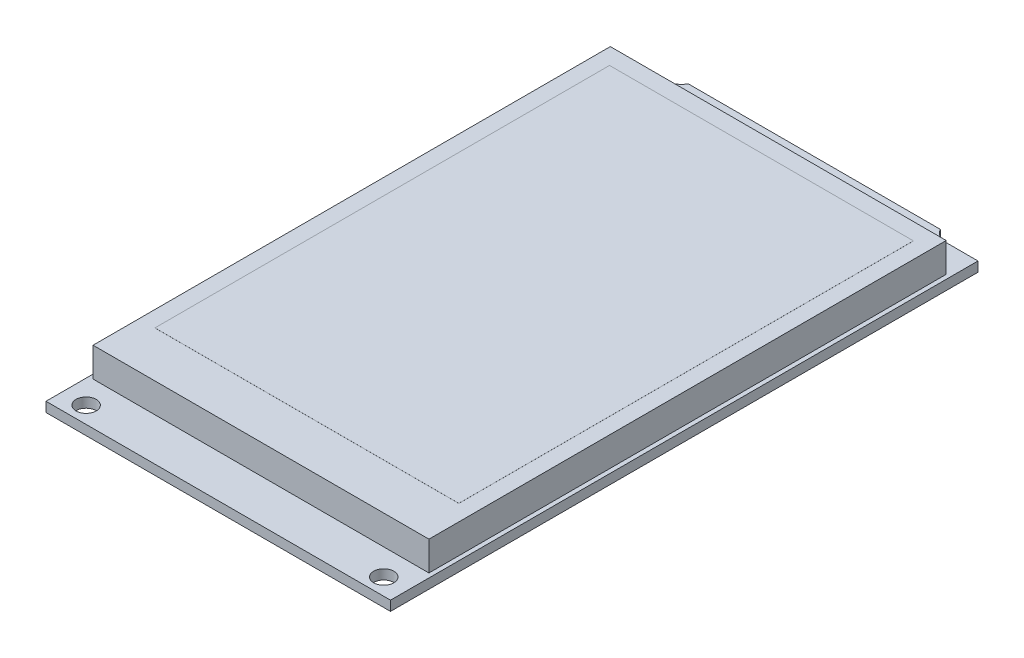
ISO-10303-21;
HEADER;
FILE_DESCRIPTION(('STEP AP214'),'2;1');
FILE_NAME('part.step','',(''),(''),'','','');
FILE_SCHEMA(('AUTOMOTIVE_DESIGN { 1 0 10303 214 1 1 1 1 }'));
ENDSEC;
DATA;
#1=APPLICATION_CONTEXT('core data for automotive mechanical design processes');
#2=APPLICATION_PROTOCOL_DEFINITION('international standard','automotive_design',2000,#1);
#3=PRODUCT_CONTEXT('',#1,'mechanical');
#4=PRODUCT('Part','Part','',(#3));
#5=PRODUCT_RELATED_PRODUCT_CATEGORY('part','',(#4));
#6=PRODUCT_DEFINITION_FORMATION('','',#4);
#7=PRODUCT_DEFINITION_CONTEXT('part definition',#1,'design');
#8=PRODUCT_DEFINITION('design','',#6,#7);
#9=PRODUCT_DEFINITION_SHAPE('','',#8);
#10=(LENGTH_UNIT() NAMED_UNIT(*) SI_UNIT(.MILLI.,.METRE.));
#11=(NAMED_UNIT(*) PLANE_ANGLE_UNIT() SI_UNIT($,.RADIAN.));
#12=(NAMED_UNIT(*) SI_UNIT($,.STERADIAN.) SOLID_ANGLE_UNIT());
#13=UNCERTAINTY_MEASURE_WITH_UNIT(LENGTH_MEASURE(1.E-05),#10,'distance_accuracy_value','');
#14=(GEOMETRIC_REPRESENTATION_CONTEXT(3) GLOBAL_UNCERTAINTY_ASSIGNED_CONTEXT((#13)) GLOBAL_UNIT_ASSIGNED_CONTEXT((#10,
#11,#12)) REPRESENTATION_CONTEXT('',''));
#15=CARTESIAN_POINT('',(0.,0.,0.));
#16=DIRECTION('',(0.,0.,1.));
#17=DIRECTION('',(1.,0.,0.));
#18=AXIS2_PLACEMENT_3D('',#15,#16,#17);
#19=CARTESIAN_POINT('',(78.3529749767891,1.6,-98.8305691327379));
#20=DIRECTION('',(0.,1.,0.));
#21=DIRECTION('',(0.,0.,1.));
#22=AXIS2_PLACEMENT_3D('',#19,#20,#21);
#23=PLANE('',#22);
#24=DIRECTION('',(0.,0.,-1.));
#25=VECTOR('',#24,1.);
#26=CARTESIAN_POINT('',(82.8863359694958,1.6,-7.));
#27=LINE('',#26,#25);
#28=CARTESIAN_POINT('',(82.8863359694958,1.6,-7.));
#29=VERTEX_POINT('',#28);
#30=CARTESIAN_POINT('',(82.8863359694958,1.6,-91.7));
#31=VERTEX_POINT('',#30);
#32=EDGE_CURVE('E160',#29,#31,#27,.T.);
#33=ORIENTED_EDGE('',*,*,#32,.F.);
#34=DIRECTION('',(1.,0.,0.));
#35=VECTOR('',#34,1.);
#36=CARTESIAN_POINT('',(55.3863359694958,1.6,-7.));
#37=LINE('',#36,#35);
#38=CARTESIAN_POINT('',(27.8863359694958,1.6,-7.));
#39=VERTEX_POINT('',#38);
#40=EDGE_CURVE('E187',#39,#29,#37,.T.);
#41=ORIENTED_EDGE('',*,*,#40,.F.);
#42=DIRECTION('',(0.,0.,1.));
#43=VECTOR('',#42,1.);
#44=CARTESIAN_POINT('',(27.8863359694958,1.6,-7.));
#45=LINE('',#44,#43);
#46=CARTESIAN_POINT('',(27.8863359694958,1.6,-91.7));
#47=VERTEX_POINT('',#46);
#48=EDGE_CURVE('E200',#47,#39,#45,.T.);
#49=ORIENTED_EDGE('',*,*,#48,.F.);
#50=DIRECTION('',(-1.,0.,0.));
#51=VECTOR('',#50,1.);
#52=CARTESIAN_POINT('',(27.8863359694958,1.6,-91.7));
#53=LINE('',#52,#51);
#54=EDGE_CURVE('E197',#31,#47,#53,.T.);
#55=ORIENTED_EDGE('',*,*,#54,.F.);
#56=EDGE_LOOP('',(#33,#41,#49,#55));
#57=FACE_BOUND('',#56,.T.);
#58=CARTESIAN_POINT('',(31.0213359694958,1.6,-2.73000000000002));
#59=DIRECTION('',(0.,1.,0.));
#60=DIRECTION('',(0.,0.,1.));
#61=AXIS2_PLACEMENT_3D('',#58,#59,#60);
#62=CIRCLE('',#61,1.65);
#63=CARTESIAN_POINT('',(31.0213359694958,1.6,-1.08000000000002));
#64=VERTEX_POINT('',#63);
#65=EDGE_CURVE('E223',#64,#64,#62,.T.);
#66=ORIENTED_EDGE('',*,*,#65,.F.);
#67=EDGE_LOOP('',(#66));
#68=FACE_BOUND('',#67,.T.);
#69=DIRECTION('',(0.,0.,1.));
#70=VECTOR('',#69,1.);
#71=CARTESIAN_POINT('',(27.1813359694958,1.6,-96.2));
#72=LINE('',#71,#70);
#73=CARTESIAN_POINT('',(27.1813359694958,1.6,-96.2));
#74=VERTEX_POINT('',#73);
#75=CARTESIAN_POINT('',(27.1813359694958,1.6,0.));
#76=VERTEX_POINT('',#75);
#77=EDGE_CURVE('E229',#74,#76,#72,.T.);
#78=ORIENTED_EDGE('',*,*,#77,.T.);
#79=DIRECTION('',(1.,0.,0.));
#80=VECTOR('',#79,1.);
#81=CARTESIAN_POINT('',(27.1813359694958,1.6,0.));
#82=LINE('',#81,#80);
#83=CARTESIAN_POINT('',(83.5913359694958,1.6,0.));
#84=VERTEX_POINT('',#83);
#85=EDGE_CURVE('E232',#76,#84,#82,.T.);
#86=ORIENTED_EDGE('',*,*,#85,.T.);
#87=DIRECTION('',(0.,0.,-1.));
#88=VECTOR('',#87,1.);
#89=CARTESIAN_POINT('',(83.5913359694958,1.6,0.));
#90=LINE('',#89,#88);
#91=CARTESIAN_POINT('',(83.5913359694958,1.6,-96.2));
#92=VERTEX_POINT('',#91);
#93=EDGE_CURVE('E235',#84,#92,#90,.T.);
#94=ORIENTED_EDGE('',*,*,#93,.T.);
#95=DIRECTION('',(-1.,0.,0.));
#96=VECTOR('',#95,1.);
#97=CARTESIAN_POINT('',(83.5913359694958,1.6,-96.2));
#98=LINE('',#97,#96);
#99=CARTESIAN_POINT('',(78.2654792706503,1.6,-96.2));
#100=VERTEX_POINT('',#99);
#101=EDGE_CURVE('E237',#92,#100,#98,.T.);
#102=ORIENTED_EDGE('',*,*,#101,.T.);
#103=CARTESIAN_POINT('',(78.3529749767891,1.6,-98.8305691327379));
#104=DIRECTION('',(0.,-1.,0.));
#105=DIRECTION('',(0.,0.,1.));
#106=AXIS2_PLACEMENT_3D('',#103,#104,#105);
#107=CIRCLE('',#106,2.63202383361284);
#108=CARTESIAN_POINT('',(76.0263359694958,1.6,-97.6));
#109=VERTEX_POINT('',#108);
#110=EDGE_CURVE('E239',#100,#109,#107,.T.);
#111=ORIENTED_EDGE('',*,*,#110,.T.);
#112=DIRECTION('',(-1.,0.,0.));
#113=VECTOR('',#112,1.);
#114=CARTESIAN_POINT('',(55.3863359694958,1.6,-97.6));
#115=LINE('',#114,#113);
#116=CARTESIAN_POINT('',(34.7463359694958,1.6,-97.6));
#117=VERTEX_POINT('',#116);
#118=EDGE_CURVE('E241',#109,#117,#115,.T.);
#119=ORIENTED_EDGE('',*,*,#118,.T.);
#120=CARTESIAN_POINT('',(32.4196969622025,1.6,-98.8305691327379));
#121=DIRECTION('',(0.,-1.,0.));
#122=DIRECTION('',(0.,0.,-1.));
#123=AXIS2_PLACEMENT_3D('',#120,#121,#122);
#124=CIRCLE('',#123,2.63202383361284);
#125=CARTESIAN_POINT('',(32.5071926683412,1.6,-96.2));
#126=VERTEX_POINT('',#125);
#127=EDGE_CURVE('E243',#117,#126,#124,.T.);
#128=ORIENTED_EDGE('',*,*,#127,.T.);
#129=DIRECTION('',(-1.,0.,0.));
#130=VECTOR('',#129,1.);
#131=CARTESIAN_POINT('',(32.5071926683412,1.6,-96.2));
#132=LINE('',#131,#130);
#133=EDGE_CURVE('E245',#126,#74,#132,.T.);
#134=ORIENTED_EDGE('',*,*,#133,.T.);
#135=EDGE_LOOP('',(#78,#86,#94,#102,#111,#119,#128,#134));
#136=FACE_BOUND('',#135,.T.);
#137=CARTESIAN_POINT('',(79.7513359694958,1.6,-2.73000000000002));
#138=DIRECTION('',(0.,1.,0.));
#139=DIRECTION('',(0.,0.,-1.));
#140=AXIS2_PLACEMENT_3D('',#137,#138,#139);
#141=CIRCLE('',#140,1.65);
#142=CARTESIAN_POINT('',(79.7513359694958,1.6,-4.38000000000003));
#143=VERTEX_POINT('',#142);
#144=EDGE_CURVE('E217',#143,#143,#141,.T.);
#145=ORIENTED_EDGE('',*,*,#144,.F.);
#146=EDGE_LOOP('',(#145));
#147=FACE_BOUND('',#146,.T.);
#148=ADVANCED_FACE('F33',(#57,#68,#136,#147),#23,.T.);
#149=CARTESIAN_POINT('',(78.3529749767891,0.,-98.8305691327379));
#150=DIRECTION('',(0.,1.,0.));
#151=DIRECTION('',(0.,0.,1.));
#152=AXIS2_PLACEMENT_3D('',#149,#150,#151);
#153=PLANE('',#152);
#154=DIRECTION('',(0.,0.,1.));
#155=VECTOR('',#154,1.);
#156=CARTESIAN_POINT('',(27.1813359694958,0.,-96.2));
#157=LINE('',#156,#155);
#158=CARTESIAN_POINT('',(27.1813359694958,0.,-96.2));
#159=VERTEX_POINT('',#158);
#160=CARTESIAN_POINT('',(27.1813359694958,0.,0.));
#161=VERTEX_POINT('',#160);
#162=EDGE_CURVE('E226',#159,#161,#157,.T.);
#163=ORIENTED_EDGE('',*,*,#162,.F.);
#164=DIRECTION('',(-1.,0.,0.));
#165=VECTOR('',#164,1.);
#166=CARTESIAN_POINT('',(32.5071926683412,0.,-96.2));
#167=LINE('',#166,#165);
#168=CARTESIAN_POINT('',(32.5071926683412,0.,-96.2));
#169=VERTEX_POINT('',#168);
#170=EDGE_CURVE('E233',#169,#159,#167,.T.);
#171=ORIENTED_EDGE('',*,*,#170,.F.);
#172=CARTESIAN_POINT('',(32.4196969622025,0.,-98.8305691327379));
#173=DIRECTION('',(0.,-1.,0.));
#174=DIRECTION('',(0.,0.,-1.));
#175=AXIS2_PLACEMENT_3D('',#172,#173,#174);
#176=CIRCLE('',#175,2.63202383361284);
#177=CARTESIAN_POINT('',(34.7463359694958,0.,-97.6));
#178=VERTEX_POINT('',#177);
#179=EDGE_CURVE('E261',#178,#169,#176,.T.);
#180=ORIENTED_EDGE('',*,*,#179,.F.);
#181=DIRECTION('',(-1.,0.,0.));
#182=VECTOR('',#181,1.);
#183=CARTESIAN_POINT('',(55.3863359694958,0.,-97.6));
#184=LINE('',#183,#182);
#185=CARTESIAN_POINT('',(76.0263359694958,0.,-97.6));
#186=VERTEX_POINT('',#185);
#187=EDGE_CURVE('E259',#186,#178,#184,.T.);
#188=ORIENTED_EDGE('',*,*,#187,.F.);
#189=CARTESIAN_POINT('',(78.3529749767891,0.,-98.8305691327379));
#190=DIRECTION('',(0.,-1.,0.));
#191=DIRECTION('',(0.,0.,1.));
#192=AXIS2_PLACEMENT_3D('',#189,#190,#191);
#193=CIRCLE('',#192,2.63202383361284);
#194=CARTESIAN_POINT('',(78.2654792706503,0.,-96.2));
#195=VERTEX_POINT('',#194);
#196=EDGE_CURVE('E256',#195,#186,#193,.T.);
#197=ORIENTED_EDGE('',*,*,#196,.F.);
#198=DIRECTION('',(-1.,0.,0.));
#199=VECTOR('',#198,1.);
#200=CARTESIAN_POINT('',(83.5913359694958,0.,-96.2));
#201=LINE('',#200,#199);
#202=CARTESIAN_POINT('',(83.5913359694958,0.,-96.2));
#203=VERTEX_POINT('',#202);
#204=EDGE_CURVE('E254',#203,#195,#201,.T.);
#205=ORIENTED_EDGE('',*,*,#204,.F.);
#206=DIRECTION('',(0.,0.,-1.));
#207=VECTOR('',#206,1.);
#208=CARTESIAN_POINT('',(83.5913359694958,0.,0.));
#209=LINE('',#208,#207);
#210=CARTESIAN_POINT('',(83.5913359694958,0.,0.));
#211=VERTEX_POINT('',#210);
#212=EDGE_CURVE('E252',#211,#203,#209,.T.);
#213=ORIENTED_EDGE('',*,*,#212,.F.);
#214=DIRECTION('',(1.,0.,0.));
#215=VECTOR('',#214,1.);
#216=CARTESIAN_POINT('',(27.1813359694958,0.,0.));
#217=LINE('',#216,#215);
#218=EDGE_CURVE('E250',#161,#211,#217,.T.);
#219=ORIENTED_EDGE('',*,*,#218,.F.);
#220=EDGE_LOOP('',(#163,#171,#180,#188,#197,#205,#213,#219));
#221=FACE_BOUND('',#220,.T.);
#222=CARTESIAN_POINT('',(31.0213359694958,0.,-2.73000000000002));
#223=DIRECTION('',(0.,1.,0.));
#224=DIRECTION('',(0.,0.,1.));
#225=AXIS2_PLACEMENT_3D('',#222,#223,#224);
#226=CIRCLE('',#225,1.65);
#227=CARTESIAN_POINT('',(31.0213359694958,0.,-1.08000000000002));
#228=VERTEX_POINT('',#227);
#229=EDGE_CURVE('E220',#228,#228,#226,.T.);
#230=ORIENTED_EDGE('',*,*,#229,.T.);
#231=EDGE_LOOP('',(#230));
#232=FACE_BOUND('',#231,.T.);
#233=CARTESIAN_POINT('',(79.7513359694958,0.,-2.73000000000002));
#234=DIRECTION('',(0.,1.,0.));
#235=DIRECTION('',(0.,0.,-1.));
#236=AXIS2_PLACEMENT_3D('',#233,#234,#235);
#237=CIRCLE('',#236,1.65);
#238=CARTESIAN_POINT('',(79.7513359694958,0.,-4.38000000000003));
#239=VERTEX_POINT('',#238);
#240=EDGE_CURVE('E216',#239,#239,#237,.T.);
#241=ORIENTED_EDGE('',*,*,#240,.T.);
#242=EDGE_LOOP('',(#241));
#243=FACE_BOUND('',#242,.T.);
#244=ADVANCED_FACE('F291',(#221,#232,#243),#153,.F.);
#245=CARTESIAN_POINT('',(27.1813359694958,1.6,-96.2));
#246=DIRECTION('',(1.,0.,0.));
#247=DIRECTION('',(0.,0.,-1.));
#248=AXIS2_PLACEMENT_3D('',#245,#246,#247);
#249=PLANE('',#248);
#250=ORIENTED_EDGE('',*,*,#162,.T.);
#251=DIRECTION('',(0.,-1.,0.));
#252=VECTOR('',#251,1.);
#253=CARTESIAN_POINT('',(27.1813359694958,1.6,0.));
#254=LINE('',#253,#252);
#255=EDGE_CURVE('E11',#76,#161,#254,.T.);
#256=ORIENTED_EDGE('',*,*,#255,.F.);
#257=ORIENTED_EDGE('',*,*,#77,.F.);
#258=DIRECTION('',(0.,-1.,0.));
#259=VECTOR('',#258,1.);
#260=CARTESIAN_POINT('',(27.1813359694958,1.6,-96.2));
#261=LINE('',#260,#259);
#262=EDGE_CURVE('E247',#74,#159,#261,.T.);
#263=ORIENTED_EDGE('',*,*,#262,.T.);
#264=EDGE_LOOP('',(#250,#256,#257,#263));
#265=FACE_BOUND('',#264,.T.);
#266=ADVANCED_FACE('F35',(#265),#249,.F.);
#267=CARTESIAN_POINT('',(27.1813359694958,1.6,0.));
#268=DIRECTION('',(0.,0.,-1.));
#269=DIRECTION('',(-1.,0.,0.));
#270=AXIS2_PLACEMENT_3D('',#267,#268,#269);
#271=PLANE('',#270);
#272=ORIENTED_EDGE('',*,*,#218,.T.);
#273=DIRECTION('',(0.,-1.,0.));
#274=VECTOR('',#273,1.);
#275=CARTESIAN_POINT('',(83.5913359694958,1.6,0.));
#276=LINE('',#275,#274);
#277=EDGE_CURVE('E41',#84,#211,#276,.T.);
#278=ORIENTED_EDGE('',*,*,#277,.F.);
#279=ORIENTED_EDGE('',*,*,#85,.F.);
#280=ORIENTED_EDGE('',*,*,#255,.T.);
#281=EDGE_LOOP('',(#272,#278,#279,#280));
#282=FACE_BOUND('',#281,.T.);
#283=ADVANCED_FACE('F308',(#282),#271,.F.);
#284=CARTESIAN_POINT('',(83.5913359694958,1.6,0.));
#285=DIRECTION('',(-1.,0.,0.));
#286=DIRECTION('',(0.,0.,1.));
#287=AXIS2_PLACEMENT_3D('',#284,#285,#286);
#288=PLANE('',#287);
#289=ORIENTED_EDGE('',*,*,#212,.T.);
#290=DIRECTION('',(0.,-1.,0.));
#291=VECTOR('',#290,1.);
#292=CARTESIAN_POINT('',(83.5913359694958,1.6,-96.2));
#293=LINE('',#292,#291);
#294=EDGE_CURVE('E278',#92,#203,#293,.T.);
#295=ORIENTED_EDGE('',*,*,#294,.F.);
#296=ORIENTED_EDGE('',*,*,#93,.F.);
#297=ORIENTED_EDGE('',*,*,#277,.T.);
#298=EDGE_LOOP('',(#289,#295,#296,#297));
#299=FACE_BOUND('',#298,.T.);
#300=ADVANCED_FACE('F285',(#299),#288,.F.);
#301=CARTESIAN_POINT('',(83.5913359694958,1.6,-96.2));
#302=DIRECTION('',(0.,0.,1.));
#303=DIRECTION('',(1.,0.,0.));
#304=AXIS2_PLACEMENT_3D('',#301,#302,#303);
#305=PLANE('',#304);
#306=ORIENTED_EDGE('',*,*,#204,.T.);
#307=DIRECTION('',(0.,-1.,0.));
#308=VECTOR('',#307,1.);
#309=CARTESIAN_POINT('',(78.2654792706503,1.6,-96.2));
#310=LINE('',#309,#308);
#311=EDGE_CURVE('E275',#100,#195,#310,.T.);
#312=ORIENTED_EDGE('',*,*,#311,.F.);
#313=ORIENTED_EDGE('',*,*,#101,.F.);
#314=ORIENTED_EDGE('',*,*,#294,.T.);
#315=EDGE_LOOP('',(#306,#312,#313,#314));
#316=FACE_BOUND('',#315,.T.);
#317=ADVANCED_FACE('F296',(#316),#305,.F.);
#318=CARTESIAN_POINT('',(78.3529749767891,1.6,-98.8305691327379));
#319=DIRECTION('',(0.,-1.,0.));
#320=DIRECTION('',(0.,0.,-1.));
#321=AXIS2_PLACEMENT_3D('',#318,#319,#320);
#322=CYLINDRICAL_SURFACE('',#321,2.63202383361284);
#323=ORIENTED_EDGE('',*,*,#196,.T.);
#324=DIRECTION('',(0.,-1.,0.));
#325=VECTOR('',#324,1.);
#326=CARTESIAN_POINT('',(76.0263359694958,1.6,-97.6));
#327=LINE('',#326,#325);
#328=EDGE_CURVE('E272',#109,#186,#327,.T.);
#329=ORIENTED_EDGE('',*,*,#328,.F.);
#330=ORIENTED_EDGE('',*,*,#110,.F.);
#331=ORIENTED_EDGE('',*,*,#311,.T.);
#332=EDGE_LOOP('',(#323,#329,#330,#331));
#333=FACE_BOUND('',#332,.T.);
#334=ADVANCED_FACE('F300',(#333),#322,.F.);
#335=CARTESIAN_POINT('',(55.3863359694958,1.6,-97.6));
#336=DIRECTION('',(0.,0.,1.));
#337=DIRECTION('',(1.,0.,0.));
#338=AXIS2_PLACEMENT_3D('',#335,#336,#337);
#339=PLANE('',#338);
#340=ORIENTED_EDGE('',*,*,#187,.T.);
#341=DIRECTION('',(0.,-1.,0.));
#342=VECTOR('',#341,1.);
#343=CARTESIAN_POINT('',(34.7463359694958,1.6,-97.6));
#344=LINE('',#343,#342);
#345=EDGE_CURVE('E269',#117,#178,#344,.T.);
#346=ORIENTED_EDGE('',*,*,#345,.F.);
#347=ORIENTED_EDGE('',*,*,#118,.F.);
#348=ORIENTED_EDGE('',*,*,#328,.T.);
#349=EDGE_LOOP('',(#340,#346,#347,#348));
#350=FACE_BOUND('',#349,.T.);
#351=ADVANCED_FACE('F321',(#350),#339,.F.);
#352=CARTESIAN_POINT('',(32.4196969622025,1.6,-98.8305691327379));
#353=DIRECTION('',(0.,-1.,0.));
#354=DIRECTION('',(0.,0.,-1.));
#355=AXIS2_PLACEMENT_3D('',#352,#353,#354);
#356=CYLINDRICAL_SURFACE('',#355,2.63202383361284);
#357=ORIENTED_EDGE('',*,*,#179,.T.);
#358=DIRECTION('',(0.,-1.,0.));
#359=VECTOR('',#358,1.);
#360=CARTESIAN_POINT('',(32.5071926683412,1.6,-96.2));
#361=LINE('',#360,#359);
#362=EDGE_CURVE('E266',#126,#169,#361,.T.);
#363=ORIENTED_EDGE('',*,*,#362,.F.);
#364=ORIENTED_EDGE('',*,*,#127,.F.);
#365=ORIENTED_EDGE('',*,*,#345,.T.);
#366=EDGE_LOOP('',(#357,#363,#364,#365));
#367=FACE_BOUND('',#366,.T.);
#368=ADVANCED_FACE('F319',(#367),#356,.F.);
#369=CARTESIAN_POINT('',(32.5071926683412,1.6,-96.2));
#370=DIRECTION('',(0.,0.,1.));
#371=DIRECTION('',(1.,0.,0.));
#372=AXIS2_PLACEMENT_3D('',#369,#370,#371);
#373=PLANE('',#372);
#374=ORIENTED_EDGE('',*,*,#170,.T.);
#375=ORIENTED_EDGE('',*,*,#262,.F.);
#376=ORIENTED_EDGE('',*,*,#133,.F.);
#377=ORIENTED_EDGE('',*,*,#362,.T.);
#378=EDGE_LOOP('',(#374,#375,#376,#377));
#379=FACE_BOUND('',#378,.T.);
#380=ADVANCED_FACE('F314',(#379),#373,.F.);
#381=CARTESIAN_POINT('',(31.0213359694958,1.6,-2.73000000000002));
#382=DIRECTION('',(0.,-1.,0.));
#383=DIRECTION('',(0.,0.,-1.));
#384=AXIS2_PLACEMENT_3D('',#381,#382,#383);
#385=CYLINDRICAL_SURFACE('',#384,1.65);
#386=ORIENTED_EDGE('',*,*,#65,.T.);
#387=EDGE_LOOP('',(#386));
#388=FACE_BOUND('',#387,.T.);
#389=ORIENTED_EDGE('',*,*,#229,.F.);
#390=EDGE_LOOP('',(#389));
#391=FACE_BOUND('',#390,.T.);
#392=ADVANCED_FACE('F339',(#388,#391),#385,.F.);
#393=CARTESIAN_POINT('',(79.7513359694958,1.6,-2.73000000000002));
#394=DIRECTION('',(0.,-1.,0.));
#395=DIRECTION('',(0.,0.,-1.));
#396=AXIS2_PLACEMENT_3D('',#393,#394,#395);
#397=CYLINDRICAL_SURFACE('',#396,1.65);
#398=ORIENTED_EDGE('',*,*,#144,.T.);
#399=EDGE_LOOP('',(#398));
#400=FACE_BOUND('',#399,.T.);
#401=ORIENTED_EDGE('',*,*,#240,.F.);
#402=EDGE_LOOP('',(#401));
#403=FACE_BOUND('',#402,.T.);
#404=ADVANCED_FACE('F346',(#400,#403),#397,.F.);
#405=CARTESIAN_POINT('',(82.8863359694958,6.4,-7.));
#406=DIRECTION('',(-1.,0.,0.));
#407=DIRECTION('',(0.,0.,1.));
#408=AXIS2_PLACEMENT_3D('',#405,#406,#407);
#409=PLANE('',#408);
#410=ORIENTED_EDGE('',*,*,#32,.T.);
#411=DIRECTION('',(0.,-1.,0.));
#412=VECTOR('',#411,1.);
#413=CARTESIAN_POINT('',(82.8863359694958,6.4,-91.7));
#414=LINE('',#413,#412);
#415=CARTESIAN_POINT('',(82.8863359694958,6.4,-91.7));
#416=VERTEX_POINT('',#415);
#417=EDGE_CURVE('E210',#416,#31,#414,.T.);
#418=ORIENTED_EDGE('',*,*,#417,.F.);
#419=DIRECTION('',(0.,0.,-1.));
#420=VECTOR('',#419,1.);
#421=CARTESIAN_POINT('',(82.8863359694958,6.4,-7.));
#422=LINE('',#421,#420);
#423=CARTESIAN_POINT('',(82.8863359694958,6.4,-7.));
#424=VERTEX_POINT('',#423);
#425=EDGE_CURVE('E186',#424,#416,#422,.T.);
#426=ORIENTED_EDGE('',*,*,#425,.F.);
#427=DIRECTION('',(0.,-1.,0.));
#428=VECTOR('',#427,1.);
#429=CARTESIAN_POINT('',(82.8863359694958,6.4,-7.));
#430=LINE('',#429,#428);
#431=EDGE_CURVE('E213',#424,#29,#430,.T.);
#432=ORIENTED_EDGE('',*,*,#431,.T.);
#433=EDGE_LOOP('',(#410,#418,#426,#432));
#434=FACE_BOUND('',#433,.T.);
#435=ADVANCED_FACE('F351',(#434),#409,.F.);
#436=CARTESIAN_POINT('',(27.8863359694958,6.4,-91.7));
#437=DIRECTION('',(0.,0.,1.));
#438=DIRECTION('',(1.,0.,0.));
#439=AXIS2_PLACEMENT_3D('',#436,#437,#438);
#440=PLANE('',#439);
#441=ORIENTED_EDGE('',*,*,#54,.T.);
#442=DIRECTION('',(0.,-1.,0.));
#443=VECTOR('',#442,1.);
#444=CARTESIAN_POINT('',(27.8863359694958,6.4,-91.7));
#445=LINE('',#444,#443);
#446=CARTESIAN_POINT('',(27.8863359694958,6.4,-91.7));
#447=VERTEX_POINT('',#446);
#448=EDGE_CURVE('E207',#447,#47,#445,.T.);
#449=ORIENTED_EDGE('',*,*,#448,.F.);
#450=DIRECTION('',(-1.,0.,0.));
#451=VECTOR('',#450,1.);
#452=CARTESIAN_POINT('',(27.8863359694958,6.4,-91.7));
#453=LINE('',#452,#451);
#454=EDGE_CURVE('E189',#416,#447,#453,.T.);
#455=ORIENTED_EDGE('',*,*,#454,.F.);
#456=ORIENTED_EDGE('',*,*,#417,.T.);
#457=EDGE_LOOP('',(#441,#449,#455,#456));
#458=FACE_BOUND('',#457,.T.);
#459=ADVANCED_FACE('F362',(#458),#440,.F.);
#460=CARTESIAN_POINT('',(27.8863359694958,6.4,-7.));
#461=DIRECTION('',(1.,0.,0.));
#462=DIRECTION('',(0.,0.,-1.));
#463=AXIS2_PLACEMENT_3D('',#460,#461,#462);
#464=PLANE('',#463);
#465=ORIENTED_EDGE('',*,*,#48,.T.);
#466=DIRECTION('',(0.,-1.,0.));
#467=VECTOR('',#466,1.);
#468=CARTESIAN_POINT('',(27.8863359694958,6.4,-7.));
#469=LINE('',#468,#467);
#470=CARTESIAN_POINT('',(27.8863359694958,6.4,-7.));
#471=VERTEX_POINT('',#470);
#472=EDGE_CURVE('E194',#471,#39,#469,.T.);
#473=ORIENTED_EDGE('',*,*,#472,.F.);
#474=DIRECTION('',(0.,0.,1.));
#475=VECTOR('',#474,1.);
#476=CARTESIAN_POINT('',(27.8863359694958,6.4,-7.));
#477=LINE('',#476,#475);
#478=EDGE_CURVE('E191',#447,#471,#477,.T.);
#479=ORIENTED_EDGE('',*,*,#478,.F.);
#480=ORIENTED_EDGE('',*,*,#448,.T.);
#481=EDGE_LOOP('',(#465,#473,#479,#480));
#482=FACE_BOUND('',#481,.T.);
#483=ADVANCED_FACE('F368',(#482),#464,.F.);
#484=CARTESIAN_POINT('',(55.3863359694958,6.4,-7.));
#485=DIRECTION('',(0.,0.,-1.));
#486=DIRECTION('',(-1.,0.,0.));
#487=AXIS2_PLACEMENT_3D('',#484,#485,#486);
#488=PLANE('',#487);
#489=ORIENTED_EDGE('',*,*,#40,.T.);
#490=ORIENTED_EDGE('',*,*,#431,.F.);
#491=DIRECTION('',(1.,0.,0.));
#492=VECTOR('',#491,1.);
#493=CARTESIAN_POINT('',(55.3863359694958,6.4,-7.));
#494=LINE('',#493,#492);
#495=EDGE_CURVE('E183',#471,#424,#494,.T.);
#496=ORIENTED_EDGE('',*,*,#495,.F.);
#497=ORIENTED_EDGE('',*,*,#472,.T.);
#498=EDGE_LOOP('',(#489,#490,#496,#497));
#499=FACE_BOUND('',#498,.T.);
#500=ADVANCED_FACE('F372',(#499),#488,.F.);
#501=CARTESIAN_POINT('',(0.,6.4,0.));
#502=DIRECTION('',(0.,1.,0.));
#503=DIRECTION('',(0.,0.,1.));
#504=AXIS2_PLACEMENT_3D('',#501,#502,#503);
#505=PLANE('',#504);
#506=DIRECTION('',(-1.,0.,0.));
#507=VECTOR('',#506,1.);
#508=CARTESIAN_POINT('',(55.3863359694958,6.4,-88.95));
#509=LINE('',#508,#507);
#510=CARTESIAN_POINT('',(80.2663359694958,6.4,-88.95));
#511=VERTEX_POINT('',#510);
#512=CARTESIAN_POINT('',(30.5063359694958,6.4,-88.95));
#513=VERTEX_POINT('',#512);
#514=EDGE_CURVE('E48',#511,#513,#509,.T.);
#515=ORIENTED_EDGE('',*,*,#514,.F.);
#516=DIRECTION('',(0.,0.,-1.));
#517=VECTOR('',#516,1.);
#518=CARTESIAN_POINT('',(80.2663359694958,6.4,-14.51));
#519=LINE('',#518,#517);
#520=CARTESIAN_POINT('',(80.2663359694958,6.4,-14.51));
#521=VERTEX_POINT('',#520);
#522=EDGE_CURVE('E52',#521,#511,#519,.T.);
#523=ORIENTED_EDGE('',*,*,#522,.F.);
#524=DIRECTION('',(1.,0.,0.));
#525=VECTOR('',#524,1.);
#526=CARTESIAN_POINT('',(30.5063359694958,6.4,-14.51));
#527=LINE('',#526,#525);
#528=CARTESIAN_POINT('',(30.5063359694958,6.4,-14.51));
#529=VERTEX_POINT('',#528);
#530=EDGE_CURVE('E175',#529,#521,#527,.T.);
#531=ORIENTED_EDGE('',*,*,#530,.F.);
#532=DIRECTION('',(0.,0.,1.));
#533=VECTOR('',#532,1.);
#534=CARTESIAN_POINT('',(30.5063359694958,6.4,-88.95));
#535=LINE('',#534,#533);
#536=EDGE_CURVE('E173',#513,#529,#535,.T.);
#537=ORIENTED_EDGE('',*,*,#536,.F.);
#538=EDGE_LOOP('',(#515,#523,#531,#537));
#539=FACE_BOUND('',#538,.T.);
#540=ORIENTED_EDGE('',*,*,#495,.T.);
#541=ORIENTED_EDGE('',*,*,#425,.T.);
#542=ORIENTED_EDGE('',*,*,#454,.T.);
#543=ORIENTED_EDGE('',*,*,#478,.T.);
#544=EDGE_LOOP('',(#540,#541,#542,#543));
#545=FACE_BOUND('',#544,.T.);
#546=ADVANCED_FACE('F376',(#539,#545),#505,.T.);
#547=CARTESIAN_POINT('',(55.3863359694958,6.41,-88.95));
#548=DIRECTION('',(0.,0.,1.));
#549=DIRECTION('',(1.,0.,0.));
#550=AXIS2_PLACEMENT_3D('',#547,#548,#549);
#551=PLANE('',#550);
#552=ORIENTED_EDGE('',*,*,#514,.T.);
#553=DIRECTION('',(0.,-1.,0.));
#554=VECTOR('',#553,1.);
#555=CARTESIAN_POINT('',(30.5063359694958,6.41,-88.95));
#556=LINE('',#555,#554);
#557=CARTESIAN_POINT('',(30.5063359694958,6.41,-88.95));
#558=VERTEX_POINT('',#557);
#559=EDGE_CURVE('E156',#558,#513,#556,.T.);
#560=ORIENTED_EDGE('',*,*,#559,.F.);
#561=DIRECTION('',(-1.,0.,0.));
#562=VECTOR('',#561,1.);
#563=CARTESIAN_POINT('',(80.2663359694958,6.41,-88.95));
#564=LINE('',#563,#562);
#565=CARTESIAN_POINT('',(80.2663359694958,6.41,-88.95));
#566=VERTEX_POINT('',#565);
#567=EDGE_CURVE('E143',#566,#558,#564,.T.);
#568=ORIENTED_EDGE('',*,*,#567,.F.);
#569=DIRECTION('',(0.,-1.,0.));
#570=VECTOR('',#569,1.);
#571=CARTESIAN_POINT('',(80.2663359694958,6.41,-88.95));
#572=LINE('',#571,#570);
#573=EDGE_CURVE('E171',#566,#511,#572,.T.);
#574=ORIENTED_EDGE('',*,*,#573,.T.);
#575=EDGE_LOOP('',(#552,#560,#568,#574));
#576=FACE_BOUND('',#575,.T.);
#577=ADVANCED_FACE('F157',(#576),#551,.F.);
#578=CARTESIAN_POINT('',(30.5063359694958,6.41,-88.95));
#579=DIRECTION('',(1.,0.,0.));
#580=DIRECTION('',(0.,0.,-1.));
#581=AXIS2_PLACEMENT_3D('',#578,#579,#580);
#582=PLANE('',#581);
#583=ORIENTED_EDGE('',*,*,#536,.T.);
#584=DIRECTION('',(0.,-1.,0.));
#585=VECTOR('',#584,1.);
#586=CARTESIAN_POINT('',(30.5063359694958,6.41,-14.51));
#587=LINE('',#586,#585);
#588=CARTESIAN_POINT('',(30.5063359694958,6.41,-14.51));
#589=VERTEX_POINT('',#588);
#590=EDGE_CURVE('E161',#589,#529,#587,.T.);
#591=ORIENTED_EDGE('',*,*,#590,.F.);
#592=DIRECTION('',(0.,0.,1.));
#593=VECTOR('',#592,1.);
#594=CARTESIAN_POINT('',(30.5063359694958,6.41,-88.95));
#595=LINE('',#594,#593);
#596=EDGE_CURVE('E147',#558,#589,#595,.T.);
#597=ORIENTED_EDGE('',*,*,#596,.F.);
#598=ORIENTED_EDGE('',*,*,#559,.T.);
#599=EDGE_LOOP('',(#583,#591,#597,#598));
#600=FACE_BOUND('',#599,.T.);
#601=ADVANCED_FACE('F163',(#600),#582,.F.);
#602=CARTESIAN_POINT('',(30.5063359694958,6.41,-14.51));
#603=DIRECTION('',(0.,0.,-1.));
#604=DIRECTION('',(-1.,0.,0.));
#605=AXIS2_PLACEMENT_3D('',#602,#603,#604);
#606=PLANE('',#605);
#607=ORIENTED_EDGE('',*,*,#530,.T.);
#608=DIRECTION('',(0.,-1.,0.));
#609=VECTOR('',#608,1.);
#610=CARTESIAN_POINT('',(80.2663359694958,6.41,-14.51));
#611=LINE('',#610,#609);
#612=CARTESIAN_POINT('',(80.2663359694958,6.41,-14.51));
#613=VERTEX_POINT('',#612);
#614=EDGE_CURVE('E179',#613,#521,#611,.T.);
#615=ORIENTED_EDGE('',*,*,#614,.F.);
#616=DIRECTION('',(1.,0.,0.));
#617=VECTOR('',#616,1.);
#618=CARTESIAN_POINT('',(30.5063359694958,6.41,-14.51));
#619=LINE('',#618,#617);
#620=EDGE_CURVE('E166',#589,#613,#619,.T.);
#621=ORIENTED_EDGE('',*,*,#620,.F.);
#622=ORIENTED_EDGE('',*,*,#590,.T.);
#623=EDGE_LOOP('',(#607,#615,#621,#622));
#624=FACE_BOUND('',#623,.T.);
#625=ADVANCED_FACE('F384',(#624),#606,.F.);
#626=CARTESIAN_POINT('',(80.2663359694958,6.41,-14.51));
#627=DIRECTION('',(-1.,0.,0.));
#628=DIRECTION('',(0.,0.,1.));
#629=AXIS2_PLACEMENT_3D('',#626,#627,#628);
#630=PLANE('',#629);
#631=ORIENTED_EDGE('',*,*,#522,.T.);
#632=ORIENTED_EDGE('',*,*,#573,.F.);
#633=DIRECTION('',(0.,0.,-1.));
#634=VECTOR('',#633,1.);
#635=CARTESIAN_POINT('',(80.2663359694958,6.41,-14.51));
#636=LINE('',#635,#634);
#637=EDGE_CURVE('E150',#613,#566,#636,.T.);
#638=ORIENTED_EDGE('',*,*,#637,.F.);
#639=ORIENTED_EDGE('',*,*,#614,.T.);
#640=EDGE_LOOP('',(#631,#632,#638,#639));
#641=FACE_BOUND('',#640,.T.);
#642=ADVANCED_FACE('F387',(#641),#630,.F.);
#643=CARTESIAN_POINT('',(0.,6.41,0.));
#644=DIRECTION('',(0.,1.,0.));
#645=DIRECTION('',(0.,0.,1.));
#646=AXIS2_PLACEMENT_3D('',#643,#644,#645);
#647=PLANE('',#646);
#648=ORIENTED_EDGE('',*,*,#567,.T.);
#649=ORIENTED_EDGE('',*,*,#596,.T.);
#650=ORIENTED_EDGE('',*,*,#620,.T.);
#651=ORIENTED_EDGE('',*,*,#637,.T.);
#652=EDGE_LOOP('',(#648,#649,#650,#651));
#653=FACE_BOUND('',#652,.T.);
#654=ADVANCED_FACE('F145',(#653),#647,.T.);
#655=CLOSED_SHELL('',(#148,#244,#266,#283,#300,#317,#334,#351,#368,#380,#392,#404,#435,#459,
#483,#500,#546,#577,#601,#625,#642,#654));
#656=MANIFOLD_SOLID_BREP('B2',#655);
#657=ADVANCED_BREP_SHAPE_REPRESENTATION('',(#18,#656),#14);
#658=SHAPE_DEFINITION_REPRESENTATION(#9,#657);
ENDSEC;
END-ISO-10303-21;
